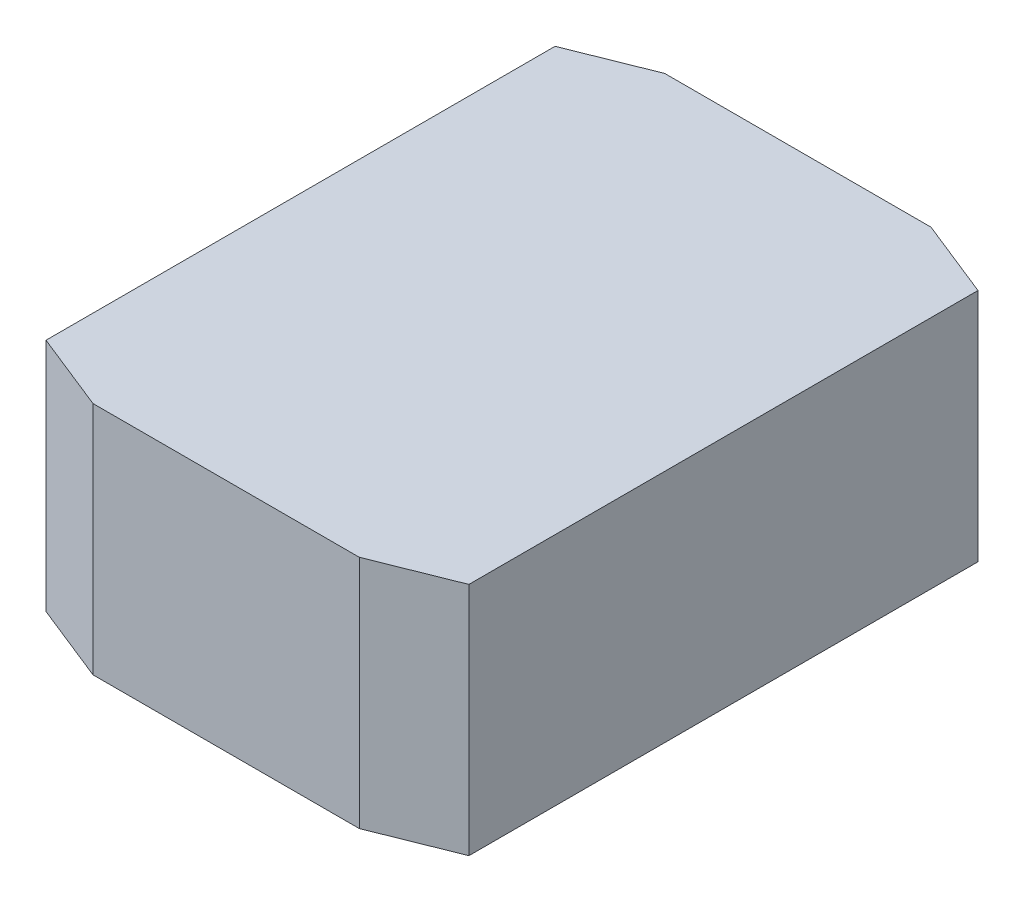
ISO-10303-21;
HEADER;
FILE_DESCRIPTION(('STEP AP214'),'2;1');
FILE_NAME('part.step','',(''),(''),'','','');
FILE_SCHEMA(('AUTOMOTIVE_DESIGN { 1 0 10303 214 1 1 1 1 }'));
ENDSEC;
DATA;
#1=APPLICATION_CONTEXT('core data for automotive mechanical design processes');
#2=APPLICATION_PROTOCOL_DEFINITION('international standard','automotive_design',2000,#1);
#3=PRODUCT_CONTEXT('',#1,'mechanical');
#4=PRODUCT('Part','Part','',(#3));
#5=PRODUCT_RELATED_PRODUCT_CATEGORY('part','',(#4));
#6=PRODUCT_DEFINITION_FORMATION('','',#4);
#7=PRODUCT_DEFINITION_CONTEXT('part definition',#1,'design');
#8=PRODUCT_DEFINITION('design','',#6,#7);
#9=PRODUCT_DEFINITION_SHAPE('','',#8);
#10=(LENGTH_UNIT() NAMED_UNIT(*) SI_UNIT(.MILLI.,.METRE.));
#11=(NAMED_UNIT(*) PLANE_ANGLE_UNIT() SI_UNIT($,.RADIAN.));
#12=(NAMED_UNIT(*) SI_UNIT($,.STERADIAN.) SOLID_ANGLE_UNIT());
#13=UNCERTAINTY_MEASURE_WITH_UNIT(LENGTH_MEASURE(1.E-05),#10,'distance_accuracy_value','');
#14=(GEOMETRIC_REPRESENTATION_CONTEXT(3) GLOBAL_UNCERTAINTY_ASSIGNED_CONTEXT((#13)) GLOBAL_UNIT_ASSIGNED_CONTEXT((#10,
#11,#12)) REPRESENTATION_CONTEXT('',''));
#15=CARTESIAN_POINT('',(0.,0.,0.));
#16=DIRECTION('',(0.,0.,1.));
#17=DIRECTION('',(1.,0.,0.));
#18=AXIS2_PLACEMENT_3D('',#15,#16,#17);
#19=CARTESIAN_POINT('',(-1350.,1500.,1825.));
#20=DIRECTION('',(1.,0.,0.));
#21=DIRECTION('',(0.,0.,-1.));
#22=AXIS2_PLACEMENT_3D('',#19,#20,#21);
#23=PLANE('',#22);
#24=DIRECTION('',(0.,1.,0.));
#25=VECTOR('',#24,1.);
#26=CARTESIAN_POINT('',(-1350.,0.,1625.));
#27=LINE('',#26,#25);
#28=CARTESIAN_POINT('',(-1350.,0.,1625.));
#29=VERTEX_POINT('',#28);
#30=CARTESIAN_POINT('',(-1350.,1500.,1625.));
#31=VERTEX_POINT('',#30);
#32=EDGE_CURVE('E147',#29,#31,#27,.T.);
#33=ORIENTED_EDGE('',*,*,#32,.T.);
#34=DIRECTION('',(0.,0.,1.));
#35=VECTOR('',#34,1.);
#36=CARTESIAN_POINT('',(-1350.,1500.,1825.));
#37=LINE('',#36,#35);
#38=CARTESIAN_POINT('',(-1350.,1500.,-1625.));
#39=VERTEX_POINT('',#38);
#40=EDGE_CURVE('E135',#39,#31,#37,.T.);
#41=ORIENTED_EDGE('',*,*,#40,.F.);
#42=DIRECTION('',(0.,1.,0.));
#43=VECTOR('',#42,1.);
#44=CARTESIAN_POINT('',(-1350.,0.,-1625.));
#45=LINE('',#44,#43);
#46=CARTESIAN_POINT('',(-1350.,0.,-1625.));
#47=VERTEX_POINT('',#46);
#48=EDGE_CURVE('E139',#47,#39,#45,.T.);
#49=ORIENTED_EDGE('',*,*,#48,.F.);
#50=DIRECTION('',(0.,0.,1.));
#51=VECTOR('',#50,1.);
#52=CARTESIAN_POINT('',(-1350.,0.,1825.));
#53=LINE('',#52,#51);
#54=EDGE_CURVE('E124',#47,#29,#53,.T.);
#55=ORIENTED_EDGE('',*,*,#54,.T.);
#56=EDGE_LOOP('',(#33,#41,#49,#55));
#57=FACE_BOUND('',#56,.T.);
#58=ADVANCED_FACE('F37',(#57),#23,.F.);
#59=CARTESIAN_POINT('',(-1350.,1500.,1825.));
#60=DIRECTION('',(0.,0.,-1.));
#61=DIRECTION('',(-1.,0.,0.));
#62=AXIS2_PLACEMENT_3D('',#59,#60,#61);
#63=PLANE('',#62);
#64=DIRECTION('',(1.,0.,0.));
#65=VECTOR('',#64,1.);
#66=CARTESIAN_POINT('',(-1350.,0.,1825.));
#67=LINE('',#66,#65);
#68=CARTESIAN_POINT('',(-850.,0.,1825.));
#69=VERTEX_POINT('',#68);
#70=CARTESIAN_POINT('',(850.,0.,1825.));
#71=VERTEX_POINT('',#70);
#72=EDGE_CURVE('E117',#69,#71,#67,.T.);
#73=ORIENTED_EDGE('',*,*,#72,.T.);
#74=DIRECTION('',(0.,1.,0.));
#75=VECTOR('',#74,1.);
#76=CARTESIAN_POINT('',(850.,0.,1825.));
#77=LINE('',#76,#75);
#78=CARTESIAN_POINT('',(850.,1500.,1825.));
#79=VERTEX_POINT('',#78);
#80=EDGE_CURVE('E101',#71,#79,#77,.T.);
#81=ORIENTED_EDGE('',*,*,#80,.T.);
#82=DIRECTION('',(1.,0.,0.));
#83=VECTOR('',#82,1.);
#84=CARTESIAN_POINT('',(-1350.,1500.,1825.));
#85=LINE('',#84,#83);
#86=CARTESIAN_POINT('',(-850.,1500.,1825.));
#87=VERTEX_POINT('',#86);
#88=EDGE_CURVE('E45',#87,#79,#85,.T.);
#89=ORIENTED_EDGE('',*,*,#88,.F.);
#90=DIRECTION('',(0.,1.,0.));
#91=VECTOR('',#90,1.);
#92=CARTESIAN_POINT('',(-850.,0.,1825.));
#93=LINE('',#92,#91);
#94=EDGE_CURVE('E122',#69,#87,#93,.T.);
#95=ORIENTED_EDGE('',*,*,#94,.F.);
#96=EDGE_LOOP('',(#73,#81,#89,#95));
#97=FACE_BOUND('',#96,.T.);
#98=ADVANCED_FACE('F121',(#97),#63,.F.);
#99=CARTESIAN_POINT('',(0.,1500.,0.));
#100=DIRECTION('',(0.,-1.,0.));
#101=DIRECTION('',(0.,0.,-1.));
#102=AXIS2_PLACEMENT_3D('',#99,#100,#101);
#103=PLANE('',#102);
#104=ORIENTED_EDGE('',*,*,#88,.T.);
#105=DIRECTION('',(-0.928476690885259,0.,0.371390676354104));
#106=VECTOR('',#105,1.);
#107=CARTESIAN_POINT('',(1350.,1500.,1625.));
#108=LINE('',#107,#106);
#109=CARTESIAN_POINT('',(1350.,1500.,1625.));
#110=VERTEX_POINT('',#109);
#111=EDGE_CURVE('E104',#110,#79,#108,.T.);
#112=ORIENTED_EDGE('',*,*,#111,.F.);
#113=DIRECTION('',(0.,0.,-1.));
#114=VECTOR('',#113,1.);
#115=CARTESIAN_POINT('',(1350.,1500.,1825.));
#116=LINE('',#115,#114);
#117=CARTESIAN_POINT('',(1350.,1500.,-1625.));
#118=VERTEX_POINT('',#117);
#119=EDGE_CURVE('E123',#110,#118,#116,.T.);
#120=ORIENTED_EDGE('',*,*,#119,.T.);
#121=DIRECTION('',(-0.928476690885259,0.,-0.371390676354104));
#122=VECTOR('',#121,1.);
#123=CARTESIAN_POINT('',(1350.,1500.,-1625.));
#124=LINE('',#123,#122);
#125=CARTESIAN_POINT('',(850.,1500.,-1825.));
#126=VERTEX_POINT('',#125);
#127=EDGE_CURVE('E109',#118,#126,#124,.T.);
#128=ORIENTED_EDGE('',*,*,#127,.T.);
#129=DIRECTION('',(-1.,0.,0.));
#130=VECTOR('',#129,1.);
#131=CARTESIAN_POINT('',(-1350.,1500.,-1825.));
#132=LINE('',#131,#130);
#133=CARTESIAN_POINT('',(-850.,1500.,-1825.));
#134=VERTEX_POINT('',#133);
#135=EDGE_CURVE('E125',#126,#134,#132,.T.);
#136=ORIENTED_EDGE('',*,*,#135,.T.);
#137=DIRECTION('',(0.928476690885259,0.,-0.371390676354104));
#138=VECTOR('',#137,1.);
#139=CARTESIAN_POINT('',(-1350.,1500.,-1625.));
#140=LINE('',#139,#138);
#141=EDGE_CURVE('E144',#39,#134,#140,.T.);
#142=ORIENTED_EDGE('',*,*,#141,.F.);
#143=ORIENTED_EDGE('',*,*,#40,.T.);
#144=DIRECTION('',(0.928476690885259,0.,0.371390676354104));
#145=VECTOR('',#144,1.);
#146=CARTESIAN_POINT('',(-1350.,1500.,1625.));
#147=LINE('',#146,#145);
#148=EDGE_CURVE('E154',#31,#87,#147,.T.);
#149=ORIENTED_EDGE('',*,*,#148,.T.);
#150=EDGE_LOOP('',(#104,#112,#120,#128,#136,#142,#143,#149));
#151=FACE_BOUND('',#150,.T.);
#152=ADVANCED_FACE('F200',(#151),#103,.F.);
#153=CARTESIAN_POINT('',(0.,0.,0.));
#154=DIRECTION('',(0.,-1.,0.));
#155=DIRECTION('',(0.,0.,-1.));
#156=AXIS2_PLACEMENT_3D('',#153,#154,#155);
#157=PLANE('',#156);
#158=CARTESIAN_POINT('',(0.,0.,0.));
#159=DIRECTION('',(0.,-1.,0.));
#160=DIRECTION('',(0.,0.,-1.));
#161=AXIS2_PLACEMENT_3D('',#158,#159,#160);
#162=CIRCLE('',#161,500.);
#163=CARTESIAN_POINT('',(0.,0.,-500.));
#164=VERTEX_POINT('',#163);
#165=EDGE_CURVE('E168',#164,#164,#162,.T.);
#166=ORIENTED_EDGE('',*,*,#165,.F.);
#167=EDGE_LOOP('',(#166));
#168=FACE_BOUND('',#167,.T.);
#169=DIRECTION('',(-0.928476690885259,0.,0.371390676354104));
#170=VECTOR('',#169,1.);
#171=CARTESIAN_POINT('',(1350.,0.,1625.));
#172=LINE('',#171,#170);
#173=CARTESIAN_POINT('',(1350.,0.,1625.));
#174=VERTEX_POINT('',#173);
#175=EDGE_CURVE('E52',#174,#71,#172,.T.);
#176=ORIENTED_EDGE('',*,*,#175,.T.);
#177=ORIENTED_EDGE('',*,*,#72,.F.);
#178=DIRECTION('',(0.928476690885259,0.,0.371390676354104));
#179=VECTOR('',#178,1.);
#180=CARTESIAN_POINT('',(-1350.,0.,1625.));
#181=LINE('',#180,#179);
#182=EDGE_CURVE('E151',#29,#69,#181,.T.);
#183=ORIENTED_EDGE('',*,*,#182,.F.);
#184=ORIENTED_EDGE('',*,*,#54,.F.);
#185=DIRECTION('',(0.928476690885259,0.,-0.371390676354104));
#186=VECTOR('',#185,1.);
#187=CARTESIAN_POINT('',(-1350.,0.,-1625.));
#188=LINE('',#187,#186);
#189=CARTESIAN_POINT('',(-850.000000000002,0.,-1825.));
#190=VERTEX_POINT('',#189);
#191=EDGE_CURVE('E141',#47,#190,#188,.T.);
#192=ORIENTED_EDGE('',*,*,#191,.T.);
#193=DIRECTION('',(-1.,0.,0.));
#194=VECTOR('',#193,1.);
#195=CARTESIAN_POINT('',(-1350.,0.,-1825.));
#196=LINE('',#195,#194);
#197=CARTESIAN_POINT('',(850.,0.,-1825.));
#198=VERTEX_POINT('',#197);
#199=EDGE_CURVE('E128',#198,#190,#196,.T.);
#200=ORIENTED_EDGE('',*,*,#199,.F.);
#201=DIRECTION('',(-0.92847669088526,0.,-0.371390676354104));
#202=VECTOR('',#201,1.);
#203=CARTESIAN_POINT('',(746.551724137931,0.,-1866.37931034483));
#204=LINE('',#203,#202);
#205=CARTESIAN_POINT('',(1350.,0.,-1625.));
#206=VERTEX_POINT('',#205);
#207=EDGE_CURVE('E60',#206,#198,#204,.T.);
#208=ORIENTED_EDGE('',*,*,#207,.F.);
#209=DIRECTION('',(0.,0.,-1.));
#210=VECTOR('',#209,1.);
#211=CARTESIAN_POINT('',(1350.,0.,1825.));
#212=LINE('',#211,#210);
#213=EDGE_CURVE('E118',#174,#206,#212,.T.);
#214=ORIENTED_EDGE('',*,*,#213,.F.);
#215=EDGE_LOOP('',(#176,#177,#183,#184,#192,#200,#208,#214));
#216=FACE_BOUND('',#215,.T.);
#217=ADVANCED_FACE('F115',(#168,#216),#157,.T.);
#218=CARTESIAN_POINT('',(1350.,1500.,1825.));
#219=DIRECTION('',(-1.,0.,0.));
#220=DIRECTION('',(0.,0.,1.));
#221=AXIS2_PLACEMENT_3D('',#218,#219,#220);
#222=PLANE('',#221);
#223=ORIENTED_EDGE('',*,*,#119,.F.);
#224=DIRECTION('',(0.,1.,0.));
#225=VECTOR('',#224,1.);
#226=CARTESIAN_POINT('',(1350.,0.,1625.));
#227=LINE('',#226,#225);
#228=EDGE_CURVE('E110',#174,#110,#227,.T.);
#229=ORIENTED_EDGE('',*,*,#228,.F.);
#230=ORIENTED_EDGE('',*,*,#213,.T.);
#231=DIRECTION('',(0.,-1.,0.));
#232=VECTOR('',#231,1.);
#233=CARTESIAN_POINT('',(1350.,1500.,-1625.));
#234=LINE('',#233,#232);
#235=EDGE_CURVE('E160',#118,#206,#234,.T.);
#236=ORIENTED_EDGE('',*,*,#235,.F.);
#237=EDGE_LOOP('',(#223,#229,#230,#236));
#238=FACE_BOUND('',#237,.T.);
#239=ADVANCED_FACE('F39',(#238),#222,.F.);
#240=CARTESIAN_POINT('',(-1350.,1500.,-1825.));
#241=DIRECTION('',(0.,0.,1.));
#242=DIRECTION('',(1.,0.,0.));
#243=AXIS2_PLACEMENT_3D('',#240,#241,#242);
#244=PLANE('',#243);
#245=ORIENTED_EDGE('',*,*,#135,.F.);
#246=DIRECTION('',(0.,-1.,0.));
#247=VECTOR('',#246,1.);
#248=CARTESIAN_POINT('',(850.,1500.,-1825.));
#249=LINE('',#248,#247);
#250=EDGE_CURVE('E159',#126,#198,#249,.T.);
#251=ORIENTED_EDGE('',*,*,#250,.T.);
#252=ORIENTED_EDGE('',*,*,#199,.T.);
#253=DIRECTION('',(0.,1.,0.));
#254=VECTOR('',#253,1.);
#255=CARTESIAN_POINT('',(-850.,0.,-1825.));
#256=LINE('',#255,#254);
#257=EDGE_CURVE('E133',#190,#134,#256,.T.);
#258=ORIENTED_EDGE('',*,*,#257,.T.);
#259=EDGE_LOOP('',(#245,#251,#252,#258));
#260=FACE_BOUND('',#259,.T.);
#261=ADVANCED_FACE('F203',(#260),#244,.F.);
#262=CARTESIAN_POINT('',(-1350.,0.,-1625.));
#263=DIRECTION('',(0.371390676354104,0.,0.928476690885259));
#264=DIRECTION('',(0.92847669088526,0.,-0.371390676354104));
#265=AXIS2_PLACEMENT_3D('',#262,#263,#264);
#266=PLANE('',#265);
#267=ORIENTED_EDGE('',*,*,#141,.T.);
#268=ORIENTED_EDGE('',*,*,#257,.F.);
#269=ORIENTED_EDGE('',*,*,#191,.F.);
#270=ORIENTED_EDGE('',*,*,#48,.T.);
#271=EDGE_LOOP('',(#267,#268,#269,#270));
#272=FACE_BOUND('',#271,.T.);
#273=ADVANCED_FACE('F205',(#272),#266,.F.);
#274=CARTESIAN_POINT('',(-1350.,0.,1625.));
#275=DIRECTION('',(-0.371390676354104,0.,0.928476690885259));
#276=DIRECTION('',(0.92847669088526,0.,0.371390676354104));
#277=AXIS2_PLACEMENT_3D('',#274,#275,#276);
#278=PLANE('',#277);
#279=ORIENTED_EDGE('',*,*,#148,.F.);
#280=ORIENTED_EDGE('',*,*,#32,.F.);
#281=ORIENTED_EDGE('',*,*,#182,.T.);
#282=ORIENTED_EDGE('',*,*,#94,.T.);
#283=EDGE_LOOP('',(#279,#280,#281,#282));
#284=FACE_BOUND('',#283,.T.);
#285=ADVANCED_FACE('F211',(#284),#278,.T.);
#286=CARTESIAN_POINT('',(1350.,1500.,-1625.));
#287=DIRECTION('',(-0.371390676354104,0.,0.928476690885259));
#288=DIRECTION('',(0.92847669088526,0.,0.371390676354104));
#289=AXIS2_PLACEMENT_3D('',#286,#287,#288);
#290=PLANE('',#289);
#291=ORIENTED_EDGE('',*,*,#207,.T.);
#292=ORIENTED_EDGE('',*,*,#250,.F.);
#293=ORIENTED_EDGE('',*,*,#127,.F.);
#294=ORIENTED_EDGE('',*,*,#235,.T.);
#295=EDGE_LOOP('',(#291,#292,#293,#294));
#296=FACE_BOUND('',#295,.T.);
#297=ADVANCED_FACE('F191',(#296),#290,.F.);
#298=CARTESIAN_POINT('',(1350.,0.,1625.));
#299=DIRECTION('',(-0.371390676354104,0.,-0.928476690885259));
#300=DIRECTION('',(-0.92847669088526,0.,0.371390676354104));
#301=AXIS2_PLACEMENT_3D('',#298,#299,#300);
#302=PLANE('',#301);
#303=ORIENTED_EDGE('',*,*,#111,.T.);
#304=ORIENTED_EDGE('',*,*,#80,.F.);
#305=ORIENTED_EDGE('',*,*,#175,.F.);
#306=ORIENTED_EDGE('',*,*,#228,.T.);
#307=EDGE_LOOP('',(#303,#304,#305,#306));
#308=FACE_BOUND('',#307,.T.);
#309=ADVANCED_FACE('F102',(#308),#302,.F.);
#310=CARTESIAN_POINT('',(0.,-300.,0.));
#311=DIRECTION('',(0.,-1.,0.));
#312=DIRECTION('',(0.,0.,-1.));
#313=AXIS2_PLACEMENT_3D('',#310,#311,#312);
#314=PLANE('',#313);
#315=CARTESIAN_POINT('',(0.,-300.,0.));
#316=DIRECTION('',(0.,-1.,0.));
#317=DIRECTION('',(0.,0.,-1.));
#318=AXIS2_PLACEMENT_3D('',#315,#316,#317);
#319=CIRCLE('',#318,500.);
#320=CARTESIAN_POINT('',(0.,-300.,-500.));
#321=VERTEX_POINT('',#320);
#322=EDGE_CURVE('E166',#321,#321,#319,.T.);
#323=ORIENTED_EDGE('',*,*,#322,.T.);
#324=EDGE_LOOP('',(#323));
#325=FACE_BOUND('',#324,.T.);
#326=CARTESIAN_POINT('',(0.,-300.,0.));
#327=DIRECTION('',(0.,-1.,0.));
#328=DIRECTION('',(0.,0.,-1.));
#329=AXIS2_PLACEMENT_3D('',#326,#327,#328);
#330=CIRCLE('',#329,450.);
#331=CARTESIAN_POINT('',(0.,-300.,-450.));
#332=VERTEX_POINT('',#331);
#333=EDGE_CURVE('E171',#332,#332,#330,.T.);
#334=ORIENTED_EDGE('',*,*,#333,.F.);
#335=EDGE_LOOP('',(#334));
#336=FACE_BOUND('',#335,.T.);
#337=ADVANCED_FACE('F180',(#325,#336),#314,.T.);
#338=CARTESIAN_POINT('',(0.,-300.,0.));
#339=DIRECTION('',(0.,1.,0.));
#340=DIRECTION('',(0.,0.,1.));
#341=AXIS2_PLACEMENT_3D('',#338,#339,#340);
#342=CYLINDRICAL_SURFACE('',#341,500.);
#343=ORIENTED_EDGE('',*,*,#322,.F.);
#344=EDGE_LOOP('',(#343));
#345=FACE_BOUND('',#344,.T.);
#346=ORIENTED_EDGE('',*,*,#165,.T.);
#347=EDGE_LOOP('',(#346));
#348=FACE_BOUND('',#347,.T.);
#349=ADVANCED_FACE('F182',(#345,#348),#342,.T.);
#350=CARTESIAN_POINT('',(0.,-300.,0.));
#351=DIRECTION('',(0.,1.,0.));
#352=DIRECTION('',(0.,0.,1.));
#353=AXIS2_PLACEMENT_3D('',#350,#351,#352);
#354=CYLINDRICAL_SURFACE('',#353,450.);
#355=ORIENTED_EDGE('',*,*,#333,.T.);
#356=EDGE_LOOP('',(#355));
#357=FACE_BOUND('',#356,.T.);
#358=CARTESIAN_POINT('',(0.,0.,0.));
#359=DIRECTION('',(0.,-1.,0.));
#360=DIRECTION('',(0.,0.,-1.));
#361=AXIS2_PLACEMENT_3D('',#358,#359,#360);
#362=CIRCLE('',#361,450.);
#363=CARTESIAN_POINT('',(0.,0.,-450.));
#364=VERTEX_POINT('',#363);
#365=EDGE_CURVE('E11',#364,#364,#362,.F.);
#366=ORIENTED_EDGE('',*,*,#365,.T.);
#367=EDGE_LOOP('',(#366));
#368=FACE_BOUND('',#367,.T.);
#369=ADVANCED_FACE('F177',(#357,#368),#354,.F.);
#370=ORIENTED_EDGE('',*,*,#365,.F.);
#371=EDGE_LOOP('',(#370));
#372=FACE_BOUND('',#371,.T.);
#373=ADVANCED_FACE('F237',(#372),#157,.T.);
#374=CLOSED_SHELL('',(#58,#98,#152,#217,#239,#261,#273,#285,#297,#309,#337,#349,#369,#373));
#375=MANIFOLD_SOLID_BREP('B2',#374);
#376=ADVANCED_BREP_SHAPE_REPRESENTATION('',(#18,#375),#14);
#377=SHAPE_DEFINITION_REPRESENTATION(#9,#376);
ENDSEC;
END-ISO-10303-21;
